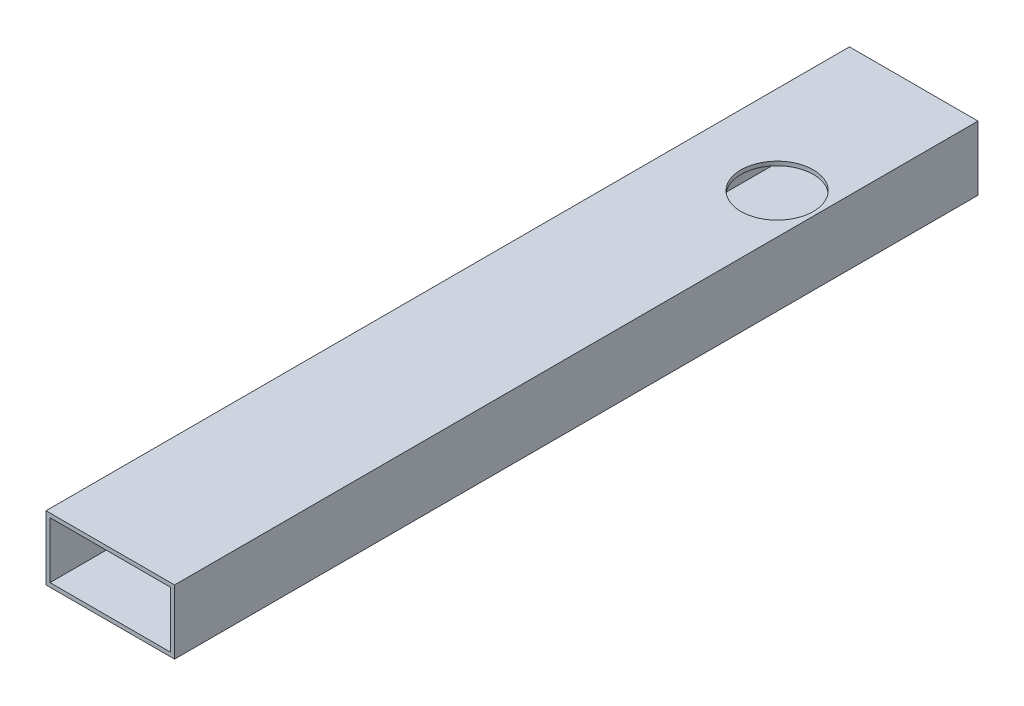
ISO-10303-21;
HEADER;
FILE_DESCRIPTION(('STEP AP214'),'2;1');
FILE_NAME('part.step','',(''),(''),'','','');
FILE_SCHEMA(('AUTOMOTIVE_DESIGN { 1 0 10303 214 1 1 1 1 }'));
ENDSEC;
DATA;
#1=APPLICATION_CONTEXT('core data for automotive mechanical design processes');
#2=APPLICATION_PROTOCOL_DEFINITION('international standard','automotive_design',2000,#1);
#3=PRODUCT_CONTEXT('',#1,'mechanical');
#4=PRODUCT('Part','Part','',(#3));
#5=PRODUCT_RELATED_PRODUCT_CATEGORY('part','',(#4));
#6=PRODUCT_DEFINITION_FORMATION('','',#4);
#7=PRODUCT_DEFINITION_CONTEXT('part definition',#1,'design');
#8=PRODUCT_DEFINITION('design','',#6,#7);
#9=PRODUCT_DEFINITION_SHAPE('','',#8);
#10=(LENGTH_UNIT() NAMED_UNIT(*) SI_UNIT(.MILLI.,.METRE.));
#11=(NAMED_UNIT(*) PLANE_ANGLE_UNIT() SI_UNIT($,.RADIAN.));
#12=(NAMED_UNIT(*) SI_UNIT($,.STERADIAN.) SOLID_ANGLE_UNIT());
#13=UNCERTAINTY_MEASURE_WITH_UNIT(LENGTH_MEASURE(1.E-05),#10,'distance_accuracy_value','');
#14=(GEOMETRIC_REPRESENTATION_CONTEXT(3) GLOBAL_UNCERTAINTY_ASSIGNED_CONTEXT((#13)) GLOBAL_UNIT_ASSIGNED_CONTEXT((#10,
#11,#12)) REPRESENTATION_CONTEXT('',''));
#15=CARTESIAN_POINT('',(0.,0.,0.));
#16=DIRECTION('',(0.,0.,1.));
#17=DIRECTION('',(1.,0.,0.));
#18=AXIS2_PLACEMENT_3D('',#15,#16,#17);
#19=CARTESIAN_POINT('',(0.,0.,158.750000508));
#20=DIRECTION('',(0.,0.,1.));
#21=DIRECTION('',(1.,0.,0.));
#22=AXIS2_PLACEMENT_3D('',#19,#20,#21);
#23=PLANE('',#22);
#24=DIRECTION('',(0.,-1.,0.));
#25=VECTOR('',#24,1.);
#26=CARTESIAN_POINT('',(-25.4,12.7,158.750000508));
#27=LINE('',#26,#25);
#28=CARTESIAN_POINT('',(-25.4,12.7,158.750000508));
#29=VERTEX_POINT('',#28);
#30=CARTESIAN_POINT('',(-25.4,-12.7,158.750000508));
#31=VERTEX_POINT('',#30);
#32=EDGE_CURVE('E116',#29,#31,#27,.T.);
#33=ORIENTED_EDGE('',*,*,#32,.T.);
#34=DIRECTION('',(1.,0.,0.));
#35=VECTOR('',#34,1.);
#36=CARTESIAN_POINT('',(-25.4,-12.7,158.750000508));
#37=LINE('',#36,#35);
#38=CARTESIAN_POINT('',(25.4,-12.7,158.750000508));
#39=VERTEX_POINT('',#38);
#40=EDGE_CURVE('E171',#31,#39,#37,.T.);
#41=ORIENTED_EDGE('',*,*,#40,.T.);
#42=DIRECTION('',(0.,1.,0.));
#43=VECTOR('',#42,1.);
#44=CARTESIAN_POINT('',(25.4,-12.7,158.750000508));
#45=LINE('',#44,#43);
#46=CARTESIAN_POINT('',(25.4,12.7,158.750000508));
#47=VERTEX_POINT('',#46);
#48=EDGE_CURVE('E173',#39,#47,#45,.T.);
#49=ORIENTED_EDGE('',*,*,#48,.T.);
#50=DIRECTION('',(-1.,0.,0.));
#51=VECTOR('',#50,1.);
#52=CARTESIAN_POINT('',(25.4,12.7,158.750000508));
#53=LINE('',#52,#51);
#54=EDGE_CURVE('E175',#47,#29,#53,.T.);
#55=ORIENTED_EDGE('',*,*,#54,.T.);
#56=EDGE_LOOP('',(#33,#41,#49,#55));
#57=FACE_BOUND('',#56,.T.);
#58=DIRECTION('',(1.,0.,0.));
#59=VECTOR('',#58,1.);
#60=CARTESIAN_POINT('',(-23.8125,-11.1125,158.750000508));
#61=LINE('',#60,#59);
#62=CARTESIAN_POINT('',(-23.8125,-11.1125,158.750000508));
#63=VERTEX_POINT('',#62);
#64=CARTESIAN_POINT('',(23.8125,-11.1125,158.750000508));
#65=VERTEX_POINT('',#64);
#66=EDGE_CURVE('E155',#63,#65,#61,.T.);
#67=ORIENTED_EDGE('',*,*,#66,.F.);
#68=DIRECTION('',(0.,-1.,0.));
#69=VECTOR('',#68,1.);
#70=CARTESIAN_POINT('',(-23.8125,11.1125,158.750000508));
#71=LINE('',#70,#69);
#72=CARTESIAN_POINT('',(-23.8125,11.1125,158.750000508));
#73=VERTEX_POINT('',#72);
#74=EDGE_CURVE('E113',#73,#63,#71,.T.);
#75=ORIENTED_EDGE('',*,*,#74,.F.);
#76=DIRECTION('',(-1.,0.,0.));
#77=VECTOR('',#76,1.);
#78=CARTESIAN_POINT('',(23.8125,11.1125,158.750000508));
#79=LINE('',#78,#77);
#80=CARTESIAN_POINT('',(23.8125,11.1125,158.750000508));
#81=VERTEX_POINT('',#80);
#82=EDGE_CURVE('E160',#81,#73,#79,.T.);
#83=ORIENTED_EDGE('',*,*,#82,.F.);
#84=DIRECTION('',(0.,1.,0.));
#85=VECTOR('',#84,1.);
#86=CARTESIAN_POINT('',(23.8125,-11.1125,158.750000508));
#87=LINE('',#86,#85);
#88=EDGE_CURVE('E157',#65,#81,#87,.T.);
#89=ORIENTED_EDGE('',*,*,#88,.F.);
#90=EDGE_LOOP('',(#67,#75,#83,#89));
#91=FACE_BOUND('',#90,.T.);
#92=ADVANCED_FACE('F37',(#57,#91),#23,.T.);
#93=CARTESIAN_POINT('',(-25.4,12.7,158.750000508));
#94=DIRECTION('',(1.,0.,0.));
#95=DIRECTION('',(0.,0.,-1.));
#96=AXIS2_PLACEMENT_3D('',#93,#94,#95);
#97=PLANE('',#96);
#98=DIRECTION('',(0.,0.,-1.));
#99=VECTOR('',#98,1.);
#100=CARTESIAN_POINT('',(-25.4,12.7,158.750000508));
#101=LINE('',#100,#99);
#102=CARTESIAN_POINT('',(-25.4,12.7,-158.750000508));
#103=VERTEX_POINT('',#102);
#104=EDGE_CURVE('E177',#29,#103,#101,.T.);
#105=ORIENTED_EDGE('',*,*,#104,.T.);
#106=DIRECTION('',(0.,-1.,0.));
#107=VECTOR('',#106,1.);
#108=CARTESIAN_POINT('',(-25.4,12.7,-158.750000508));
#109=LINE('',#108,#107);
#110=CARTESIAN_POINT('',(-25.4,-12.7,-158.750000508));
#111=VERTEX_POINT('',#110);
#112=EDGE_CURVE('E142',#103,#111,#109,.T.);
#113=ORIENTED_EDGE('',*,*,#112,.T.);
#114=DIRECTION('',(0.,0.,-1.));
#115=VECTOR('',#114,1.);
#116=CARTESIAN_POINT('',(-25.4,-12.7,158.750000508));
#117=LINE('',#116,#115);
#118=EDGE_CURVE('E11',#31,#111,#117,.T.);
#119=ORIENTED_EDGE('',*,*,#118,.F.);
#120=ORIENTED_EDGE('',*,*,#32,.F.);
#121=EDGE_LOOP('',(#105,#113,#119,#120));
#122=FACE_BOUND('',#121,.T.);
#123=ADVANCED_FACE('F39',(#122),#97,.F.);
#124=CARTESIAN_POINT('',(-25.4,-12.7,158.750000508));
#125=DIRECTION('',(0.,1.,0.));
#126=DIRECTION('',(-1.,0.,0.));
#127=AXIS2_PLACEMENT_3D('',#124,#125,#126);
#128=PLANE('',#127);
#129=CARTESIAN_POINT('',(9.52500000000001,-12.7,-95.250000508));
#130=DIRECTION('',(0.,1.,0.));
#131=DIRECTION('',(-1.,0.,0.));
#132=AXIS2_PLACEMENT_3D('',#129,#130,#131);
#133=CIRCLE('',#132,14.2875);
#134=CARTESIAN_POINT('',(-4.7625,-12.7,-95.250000508));
#135=VERTEX_POINT('',#134);
#136=EDGE_CURVE('E134',#135,#135,#133,.T.);
#137=ORIENTED_EDGE('',*,*,#136,.T.);
#138=EDGE_LOOP('',(#137));
#139=FACE_BOUND('',#138,.T.);
#140=ORIENTED_EDGE('',*,*,#118,.T.);
#141=DIRECTION('',(1.,0.,0.));
#142=VECTOR('',#141,1.);
#143=CARTESIAN_POINT('',(-25.4,-12.7,-158.750000508));
#144=LINE('',#143,#142);
#145=CARTESIAN_POINT('',(25.4,-12.7,-158.750000508));
#146=VERTEX_POINT('',#145);
#147=EDGE_CURVE('E145',#111,#146,#144,.T.);
#148=ORIENTED_EDGE('',*,*,#147,.T.);
#149=DIRECTION('',(0.,0.,-1.));
#150=VECTOR('',#149,1.);
#151=CARTESIAN_POINT('',(25.4,-12.7,158.750000508));
#152=LINE('',#151,#150);
#153=EDGE_CURVE('E46',#39,#146,#152,.T.);
#154=ORIENTED_EDGE('',*,*,#153,.F.);
#155=ORIENTED_EDGE('',*,*,#40,.F.);
#156=EDGE_LOOP('',(#140,#148,#154,#155));
#157=FACE_BOUND('',#156,.T.);
#158=ADVANCED_FACE('F191',(#139,#157),#128,.F.);
#159=CARTESIAN_POINT('',(25.4,-12.7,158.750000508));
#160=DIRECTION('',(-1.,0.,0.));
#161=DIRECTION('',(0.,0.,1.));
#162=AXIS2_PLACEMENT_3D('',#159,#160,#161);
#163=PLANE('',#162);
#164=ORIENTED_EDGE('',*,*,#153,.T.);
#165=DIRECTION('',(0.,1.,0.));
#166=VECTOR('',#165,1.);
#167=CARTESIAN_POINT('',(25.4,-12.7,-158.750000508));
#168=LINE('',#167,#166);
#169=CARTESIAN_POINT('',(25.4,12.7,-158.750000508));
#170=VERTEX_POINT('',#169);
#171=EDGE_CURVE('E148',#146,#170,#168,.T.);
#172=ORIENTED_EDGE('',*,*,#171,.T.);
#173=DIRECTION('',(0.,0.,-1.));
#174=VECTOR('',#173,1.);
#175=CARTESIAN_POINT('',(25.4,12.7,158.750000508));
#176=LINE('',#175,#174);
#177=EDGE_CURVE('E179',#47,#170,#176,.T.);
#178=ORIENTED_EDGE('',*,*,#177,.F.);
#179=ORIENTED_EDGE('',*,*,#48,.F.);
#180=EDGE_LOOP('',(#164,#172,#178,#179));
#181=FACE_BOUND('',#180,.T.);
#182=ADVANCED_FACE('F185',(#181),#163,.F.);
#183=CARTESIAN_POINT('',(25.4,12.7,158.750000508));
#184=DIRECTION('',(0.,-1.,0.));
#185=DIRECTION('',(1.,0.,0.));
#186=AXIS2_PLACEMENT_3D('',#183,#184,#185);
#187=PLANE('',#186);
#188=CARTESIAN_POINT('',(9.52500000000001,12.7,-95.250000508));
#189=DIRECTION('',(0.,1.,0.));
#190=DIRECTION('',(-1.,0.,0.));
#191=AXIS2_PLACEMENT_3D('',#188,#189,#190);
#192=CIRCLE('',#191,14.2875);
#193=CARTESIAN_POINT('',(-4.7625,12.7,-95.250000508));
#194=VERTEX_POINT('',#193);
#195=EDGE_CURVE('E211',#194,#194,#192,.T.);
#196=ORIENTED_EDGE('',*,*,#195,.F.);
#197=EDGE_LOOP('',(#196));
#198=FACE_BOUND('',#197,.T.);
#199=ORIENTED_EDGE('',*,*,#177,.T.);
#200=DIRECTION('',(-1.,0.,0.));
#201=VECTOR('',#200,1.);
#202=CARTESIAN_POINT('',(25.4,12.7,-158.750000508));
#203=LINE('',#202,#201);
#204=EDGE_CURVE('E151',#170,#103,#203,.T.);
#205=ORIENTED_EDGE('',*,*,#204,.T.);
#206=ORIENTED_EDGE('',*,*,#104,.F.);
#207=ORIENTED_EDGE('',*,*,#54,.F.);
#208=EDGE_LOOP('',(#199,#205,#206,#207));
#209=FACE_BOUND('',#208,.T.);
#210=ADVANCED_FACE('F197',(#198,#209),#187,.F.);
#211=CARTESIAN_POINT('',(-23.8125,11.1125,158.750000508));
#212=DIRECTION('',(1.,0.,0.));
#213=DIRECTION('',(0.,1.,0.));
#214=AXIS2_PLACEMENT_3D('',#211,#212,#213);
#215=PLANE('',#214);
#216=DIRECTION('',(0.,0.,-1.));
#217=VECTOR('',#216,1.);
#218=CARTESIAN_POINT('',(-23.8125,-11.1125,158.750000508));
#219=LINE('',#218,#217);
#220=CARTESIAN_POINT('',(-23.8125,-11.1125,-158.750000508));
#221=VERTEX_POINT('',#220);
#222=EDGE_CURVE('E105',#63,#221,#219,.T.);
#223=ORIENTED_EDGE('',*,*,#222,.T.);
#224=DIRECTION('',(0.,-1.,0.));
#225=VECTOR('',#224,1.);
#226=CARTESIAN_POINT('',(-23.8125,11.1125,-158.750000508));
#227=LINE('',#226,#225);
#228=CARTESIAN_POINT('',(-23.8125,11.1125,-158.750000508));
#229=VERTEX_POINT('',#228);
#230=EDGE_CURVE('E110',#229,#221,#227,.T.);
#231=ORIENTED_EDGE('',*,*,#230,.F.);
#232=DIRECTION('',(0.,0.,-1.));
#233=VECTOR('',#232,1.);
#234=CARTESIAN_POINT('',(-23.8125,11.1125,158.750000508));
#235=LINE('',#234,#233);
#236=EDGE_CURVE('E162',#73,#229,#235,.T.);
#237=ORIENTED_EDGE('',*,*,#236,.F.);
#238=ORIENTED_EDGE('',*,*,#74,.T.);
#239=EDGE_LOOP('',(#223,#231,#237,#238));
#240=FACE_BOUND('',#239,.T.);
#241=ADVANCED_FACE('F107',(#240),#215,.T.);
#242=CARTESIAN_POINT('',(-23.8125,-11.1125,158.750000508));
#243=DIRECTION('',(0.,1.,0.));
#244=DIRECTION('',(0.,0.,1.));
#245=AXIS2_PLACEMENT_3D('',#242,#243,#244);
#246=PLANE('',#245);
#247=DIRECTION('',(0.,0.,-1.));
#248=VECTOR('',#247,1.);
#249=CARTESIAN_POINT('',(23.8125,-11.1125,158.750000508));
#250=LINE('',#249,#248);
#251=CARTESIAN_POINT('',(23.8125,-11.1125,-95.250000508));
#252=VERTEX_POINT('',#251);
#253=EDGE_CURVE('E117',#65,#252,#250,.T.);
#254=ORIENTED_EDGE('',*,*,#253,.T.);
#255=CARTESIAN_POINT('',(9.52500000000001,-11.1125,-95.250000508));
#256=DIRECTION('',(0.,1.,0.));
#257=DIRECTION('',(0.,0.,1.));
#258=AXIS2_PLACEMENT_3D('',#255,#256,#257);
#259=CIRCLE('',#258,14.2875);
#260=EDGE_CURVE('E51',#252,#252,#259,.T.);
#261=ORIENTED_EDGE('',*,*,#260,.F.);
#262=CARTESIAN_POINT('',(23.8125,-11.1125,-158.750000508));
#263=VERTEX_POINT('',#262);
#264=EDGE_CURVE('E124',#252,#263,#250,.T.);
#265=ORIENTED_EDGE('',*,*,#264,.T.);
#266=DIRECTION('',(1.,0.,0.));
#267=VECTOR('',#266,1.);
#268=CARTESIAN_POINT('',(-23.8125,-11.1125,-158.750000508));
#269=LINE('',#268,#267);
#270=EDGE_CURVE('E120',#221,#263,#269,.T.);
#271=ORIENTED_EDGE('',*,*,#270,.F.);
#272=ORIENTED_EDGE('',*,*,#222,.F.);
#273=ORIENTED_EDGE('',*,*,#66,.T.);
#274=EDGE_LOOP('',(#254,#261,#265,#271,#272,#273));
#275=FACE_BOUND('',#274,.T.);
#276=ADVANCED_FACE('F122',(#275),#246,.T.);
#277=CARTESIAN_POINT('',(23.8125,-11.1125,158.750000508));
#278=DIRECTION('',(-1.,0.,0.));
#279=DIRECTION('',(0.,0.,1.));
#280=AXIS2_PLACEMENT_3D('',#277,#278,#279);
#281=PLANE('',#280);
#282=DIRECTION('',(0.,0.,-1.));
#283=VECTOR('',#282,1.);
#284=CARTESIAN_POINT('',(23.8125,11.1125,158.750000508));
#285=LINE('',#284,#283);
#286=CARTESIAN_POINT('',(23.8125,11.1125,-95.250000508));
#287=VERTEX_POINT('',#286);
#288=EDGE_CURVE('E165',#81,#287,#285,.T.);
#289=ORIENTED_EDGE('',*,*,#288,.T.);
#290=CARTESIAN_POINT('',(23.8125,11.1125,-158.750000508));
#291=VERTEX_POINT('',#290);
#292=EDGE_CURVE('E164',#287,#291,#285,.T.);
#293=ORIENTED_EDGE('',*,*,#292,.T.);
#294=DIRECTION('',(0.,1.,0.));
#295=VECTOR('',#294,1.);
#296=CARTESIAN_POINT('',(23.8125,-11.1125,-158.750000508));
#297=LINE('',#296,#295);
#298=EDGE_CURVE('E128',#263,#291,#297,.T.);
#299=ORIENTED_EDGE('',*,*,#298,.F.);
#300=ORIENTED_EDGE('',*,*,#264,.F.);
#301=ORIENTED_EDGE('',*,*,#253,.F.);
#302=ORIENTED_EDGE('',*,*,#88,.T.);
#303=EDGE_LOOP('',(#289,#293,#299,#300,#301,#302));
#304=FACE_BOUND('',#303,.T.);
#305=ADVANCED_FACE('F207',(#304),#281,.T.);
#306=CARTESIAN_POINT('',(23.8125,11.1125,158.750000508));
#307=DIRECTION('',(0.,-1.,0.));
#308=DIRECTION('',(0.,0.,-1.));
#309=AXIS2_PLACEMENT_3D('',#306,#307,#308);
#310=PLANE('',#309);
#311=ORIENTED_EDGE('',*,*,#292,.F.);
#312=CARTESIAN_POINT('',(9.52500000000001,11.1125,-95.250000508));
#313=DIRECTION('',(0.,-1.,0.));
#314=DIRECTION('',(0.,0.,-1.));
#315=AXIS2_PLACEMENT_3D('',#312,#313,#314);
#316=CIRCLE('',#315,14.2875);
#317=EDGE_CURVE('E41',#287,#287,#316,.T.);
#318=ORIENTED_EDGE('',*,*,#317,.F.);
#319=ORIENTED_EDGE('',*,*,#288,.F.);
#320=ORIENTED_EDGE('',*,*,#82,.T.);
#321=ORIENTED_EDGE('',*,*,#236,.T.);
#322=DIRECTION('',(-1.,0.,0.));
#323=VECTOR('',#322,1.);
#324=CARTESIAN_POINT('',(23.8125,11.1125,-158.750000508));
#325=LINE('',#324,#323);
#326=EDGE_CURVE('E133',#291,#229,#325,.T.);
#327=ORIENTED_EDGE('',*,*,#326,.F.);
#328=EDGE_LOOP('',(#311,#318,#319,#320,#321,#327));
#329=FACE_BOUND('',#328,.T.);
#330=ADVANCED_FACE('F210',(#329),#310,.T.);
#331=CARTESIAN_POINT('',(0.,0.,-158.750000508));
#332=DIRECTION('',(0.,0.,1.));
#333=DIRECTION('',(1.,0.,0.));
#334=AXIS2_PLACEMENT_3D('',#331,#332,#333);
#335=PLANE('',#334);
#336=ORIENTED_EDGE('',*,*,#326,.T.);
#337=ORIENTED_EDGE('',*,*,#230,.T.);
#338=ORIENTED_EDGE('',*,*,#270,.T.);
#339=ORIENTED_EDGE('',*,*,#298,.T.);
#340=EDGE_LOOP('',(#336,#337,#338,#339));
#341=FACE_BOUND('',#340,.T.);
#342=ORIENTED_EDGE('',*,*,#112,.F.);
#343=ORIENTED_EDGE('',*,*,#204,.F.);
#344=ORIENTED_EDGE('',*,*,#171,.F.);
#345=ORIENTED_EDGE('',*,*,#147,.F.);
#346=EDGE_LOOP('',(#342,#343,#344,#345));
#347=FACE_BOUND('',#346,.T.);
#348=ADVANCED_FACE('F130',(#341,#347),#335,.F.);
#349=CARTESIAN_POINT('',(9.52500000000001,-26.67,-95.250000508));
#350=DIRECTION('',(0.,1.,0.));
#351=DIRECTION('',(-1.,0.,0.));
#352=AXIS2_PLACEMENT_3D('',#349,#350,#351);
#353=CYLINDRICAL_SURFACE('',#352,14.2875);
#354=ORIENTED_EDGE('',*,*,#317,.T.);
#355=EDGE_LOOP('',(#354));
#356=FACE_BOUND('',#355,.T.);
#357=ORIENTED_EDGE('',*,*,#195,.T.);
#358=EDGE_LOOP('',(#357));
#359=FACE_BOUND('',#358,.T.);
#360=ADVANCED_FACE('F216',(#356,#359),#353,.F.);
#361=ORIENTED_EDGE('',*,*,#260,.T.);
#362=EDGE_LOOP('',(#361));
#363=FACE_BOUND('',#362,.T.);
#364=ORIENTED_EDGE('',*,*,#136,.F.);
#365=EDGE_LOOP('',(#364));
#366=FACE_BOUND('',#365,.T.);
#367=ADVANCED_FACE('F233',(#363,#366),#353,.F.);
#368=CLOSED_SHELL('',(#92,#123,#158,#182,#210,#241,#276,#305,#330,#348,#360,#367));
#369=MANIFOLD_SOLID_BREP('B2',#368);
#370=ADVANCED_BREP_SHAPE_REPRESENTATION('',(#18,#369),#14);
#371=SHAPE_DEFINITION_REPRESENTATION(#9,#370);
ENDSEC;
END-ISO-10303-21;
